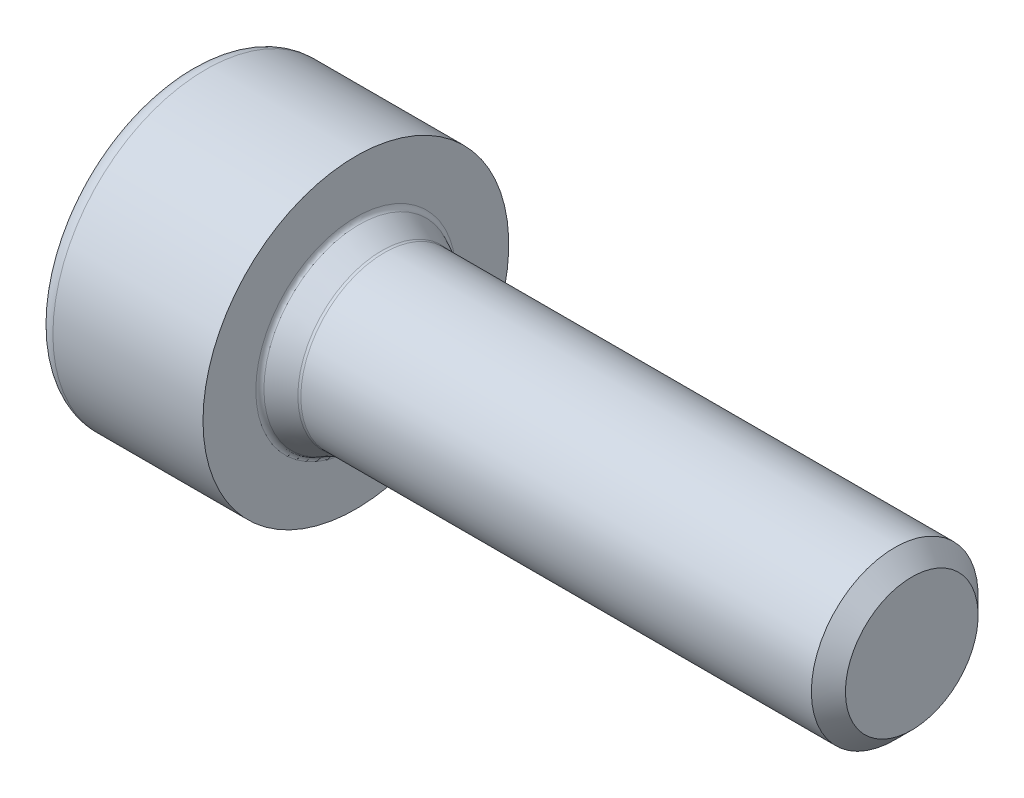
ISO-10303-21;
HEADER;
FILE_DESCRIPTION(('STEP AP214'),'2;1');
FILE_NAME('part.step','',(''),(''),'','','');
FILE_SCHEMA(('AUTOMOTIVE_DESIGN { 1 0 10303 214 1 1 1 1 }'));
ENDSEC;
DATA;
#1=APPLICATION_CONTEXT('core data for automotive mechanical design processes');
#2=APPLICATION_PROTOCOL_DEFINITION('international standard','automotive_design',2000,#1);
#3=PRODUCT_CONTEXT('',#1,'mechanical');
#4=PRODUCT('Part','Part','',(#3));
#5=PRODUCT_RELATED_PRODUCT_CATEGORY('part','',(#4));
#6=PRODUCT_DEFINITION_FORMATION('','',#4);
#7=PRODUCT_DEFINITION_CONTEXT('part definition',#1,'design');
#8=PRODUCT_DEFINITION('design','',#6,#7);
#9=PRODUCT_DEFINITION_SHAPE('','',#8);
#10=(LENGTH_UNIT() NAMED_UNIT(*) SI_UNIT(.MILLI.,.METRE.));
#11=(NAMED_UNIT(*) PLANE_ANGLE_UNIT() SI_UNIT($,.RADIAN.));
#12=(NAMED_UNIT(*) SI_UNIT($,.STERADIAN.) SOLID_ANGLE_UNIT());
#13=UNCERTAINTY_MEASURE_WITH_UNIT(LENGTH_MEASURE(1.E-05),#10,'distance_accuracy_value','');
#14=(GEOMETRIC_REPRESENTATION_CONTEXT(3) GLOBAL_UNCERTAINTY_ASSIGNED_CONTEXT((#13)) GLOBAL_UNIT_ASSIGNED_CONTEXT((#10,
#11,#12)) REPRESENTATION_CONTEXT('',''));
#15=CARTESIAN_POINT('',(0.,0.,0.));
#16=DIRECTION('',(0.,0.,1.));
#17=DIRECTION('',(1.,0.,0.));
#18=AXIS2_PLACEMENT_3D('',#15,#16,#17);
#19=CARTESIAN_POINT('',(-1.69999999999981,0.,0.));
#20=DIRECTION('',(-1.,0.,0.));
#21=DIRECTION('',(0.,0.,1.));
#22=AXIS2_PLACEMENT_3D('',#19,#20,#21);
#23=CONICAL_SURFACE('',#22,1.24999999999975,1.04719755119605);
#24=CARTESIAN_POINT('',(-0.97831216351274,0.,4.44089209850063E-13));
#25=VERTEX_POINT('',#24);
#26=VERTEX_LOOP('',#25);
#27=FACE_BOUND('',#26,.T.);
#28=CARTESIAN_POINT('',(-1.69999999999994,0.,0.));
#29=DIRECTION('',(-1.,0.,0.));
#30=DIRECTION('',(0.,0.,1.));
#31=AXIS2_PLACEMENT_3D('',#28,#29,#30);
#32=CIRCLE('',#31,1.24999999999997);
#33=CARTESIAN_POINT('',(-1.69999999999998,0.,1.24999999999998));
#34=VERTEX_POINT('',#33);
#35=CARTESIAN_POINT('',(-1.69999999999997,-1.08253175473054,0.624999999999992));
#36=VERTEX_POINT('',#35);
#37=EDGE_CURVE('E122',#34,#36,#32,.F.);
#38=ORIENTED_EDGE('',*,*,#37,.F.);
#39=CARTESIAN_POINT('',(-1.69999999999994,0.,0.));
#40=DIRECTION('',(-1.,0.,0.));
#41=DIRECTION('',(0.,0.,1.));
#42=AXIS2_PLACEMENT_3D('',#39,#40,#41);
#43=CIRCLE('',#42,1.24999999999997);
#44=CARTESIAN_POINT('',(-1.69999999999997,1.08253175473054,0.624999999999993));
#45=VERTEX_POINT('',#44);
#46=EDGE_CURVE('E645',#45,#34,#43,.F.);
#47=ORIENTED_EDGE('',*,*,#46,.F.);
#48=CARTESIAN_POINT('',(-1.69999999999994,0.,0.));
#49=DIRECTION('',(-1.,0.,0.));
#50=DIRECTION('',(0.,0.,1.));
#51=AXIS2_PLACEMENT_3D('',#48,#49,#50);
#52=CIRCLE('',#51,1.24999999999997);
#53=CARTESIAN_POINT('',(-1.69999999999997,1.08253175473054,-0.624999999999997));
#54=VERTEX_POINT('',#53);
#55=EDGE_CURVE('E111',#54,#45,#52,.F.);
#56=ORIENTED_EDGE('',*,*,#55,.F.);
#57=CARTESIAN_POINT('',(-1.69999999999994,0.,0.));
#58=DIRECTION('',(-1.,0.,0.));
#59=DIRECTION('',(0.,0.,1.));
#60=AXIS2_PLACEMENT_3D('',#57,#58,#59);
#61=CIRCLE('',#60,1.24999999999997);
#62=CARTESIAN_POINT('',(-1.69999999999998,0.,-1.24999999999999));
#63=VERTEX_POINT('',#62);
#64=EDGE_CURVE('E106',#63,#54,#61,.F.);
#65=ORIENTED_EDGE('',*,*,#64,.F.);
#66=CARTESIAN_POINT('',(-1.69999999999994,0.,0.));
#67=DIRECTION('',(-1.,0.,0.));
#68=DIRECTION('',(0.,0.,1.));
#69=AXIS2_PLACEMENT_3D('',#66,#67,#68);
#70=CIRCLE('',#69,1.24999999999997);
#71=CARTESIAN_POINT('',(-1.69999999999997,-1.08253175473054,-0.624999999999997));
#72=VERTEX_POINT('',#71);
#73=EDGE_CURVE('E104',#72,#63,#70,.F.);
#74=ORIENTED_EDGE('',*,*,#73,.F.);
#75=CARTESIAN_POINT('',(-1.69999999999994,0.,0.));
#76=DIRECTION('',(-1.,0.,0.));
#77=DIRECTION('',(0.,0.,1.));
#78=AXIS2_PLACEMENT_3D('',#75,#76,#77);
#79=CIRCLE('',#78,1.24999999999997);
#80=EDGE_CURVE('E101',#36,#72,#79,.F.);
#81=ORIENTED_EDGE('',*,*,#80,.F.);
#82=EDGE_LOOP('',(#38,#47,#56,#65,#74,#81));
#83=FACE_BOUND('',#82,.T.);
#84=ADVANCED_FACE('F16',(#27,#83),#23,.F.);
#85=CARTESIAN_POINT('',(-1.7,1.25,0.));
#86=DIRECTION('',(-1.,0.,0.));
#87=DIRECTION('',(0.,0.,1.));
#88=AXIS2_PLACEMENT_3D('',#85,#86,#87);
#89=PLANE('',#88);
#90=DIRECTION('',(0.,-0.5,0.866025403784439));
#91=VECTOR('',#90,1.);
#92=CARTESIAN_POINT('',(-1.7,-1.44337567297407,0.));
#93=LINE('',#92,#91);
#94=CARTESIAN_POINT('',(-1.7,-1.44337567297407,0.));
#95=VERTEX_POINT('',#94);
#96=EDGE_CURVE('E117',#95,#72,#93,.F.);
#97=ORIENTED_EDGE('',*,*,#96,.F.);
#98=DIRECTION('',(0.,0.5,0.866025403784439));
#99=VECTOR('',#98,1.);
#100=CARTESIAN_POINT('',(-1.7,-0.72168783648703,1.25));
#101=LINE('',#100,#99);
#102=EDGE_CURVE('E120',#36,#95,#101,.F.);
#103=ORIENTED_EDGE('',*,*,#102,.F.);
#104=ORIENTED_EDGE('',*,*,#80,.T.);
#105=EDGE_LOOP('',(#97,#103,#104));
#106=FACE_BOUND('',#105,.T.);
#107=ADVANCED_FACE('F115',(#106),#89,.T.);
#108=CARTESIAN_POINT('',(-1.7,1.25,0.));
#109=DIRECTION('',(-1.,0.,0.));
#110=DIRECTION('',(0.,0.,1.));
#111=AXIS2_PLACEMENT_3D('',#108,#109,#110);
#112=PLANE('',#111);
#113=DIRECTION('',(0.,0.5,0.866025403784439));
#114=VECTOR('',#113,1.);
#115=CARTESIAN_POINT('',(-1.7,-0.72168783648703,1.25));
#116=LINE('',#115,#114);
#117=CARTESIAN_POINT('',(-1.7,-0.72168783648703,1.25));
#118=VERTEX_POINT('',#117);
#119=EDGE_CURVE('E131',#118,#36,#116,.F.);
#120=ORIENTED_EDGE('',*,*,#119,.F.);
#121=DIRECTION('',(0.,1.,0.));
#122=VECTOR('',#121,1.);
#123=CARTESIAN_POINT('',(-1.7,0.72168783648703,1.25));
#124=LINE('',#123,#122);
#125=EDGE_CURVE('E612',#34,#118,#124,.F.);
#126=ORIENTED_EDGE('',*,*,#125,.F.);
#127=ORIENTED_EDGE('',*,*,#37,.T.);
#128=EDGE_LOOP('',(#120,#126,#127));
#129=FACE_BOUND('',#128,.T.);
#130=ADVANCED_FACE('F241',(#129),#112,.T.);
#131=CARTESIAN_POINT('',(-1.7,1.25,0.));
#132=DIRECTION('',(-1.,0.,0.));
#133=DIRECTION('',(0.,0.,1.));
#134=AXIS2_PLACEMENT_3D('',#131,#132,#133);
#135=PLANE('',#134);
#136=DIRECTION('',(0.,1.,0.));
#137=VECTOR('',#136,1.);
#138=CARTESIAN_POINT('',(-1.7,0.72168783648703,1.25));
#139=LINE('',#138,#137);
#140=CARTESIAN_POINT('',(-1.7,0.72168783648703,1.25));
#141=VERTEX_POINT('',#140);
#142=EDGE_CURVE('E616',#141,#34,#139,.F.);
#143=ORIENTED_EDGE('',*,*,#142,.F.);
#144=DIRECTION('',(0.,0.5,-0.866025403784439));
#145=VECTOR('',#144,1.);
#146=CARTESIAN_POINT('',(-1.7,1.44337567297407,0.));
#147=LINE('',#146,#145);
#148=EDGE_CURVE('E578',#45,#141,#147,.F.);
#149=ORIENTED_EDGE('',*,*,#148,.F.);
#150=ORIENTED_EDGE('',*,*,#46,.T.);
#151=EDGE_LOOP('',(#143,#149,#150));
#152=FACE_BOUND('',#151,.T.);
#153=ADVANCED_FACE('F237',(#152),#135,.T.);
#154=CARTESIAN_POINT('',(-1.7,1.25,0.));
#155=DIRECTION('',(-1.,0.,0.));
#156=DIRECTION('',(0.,0.,1.));
#157=AXIS2_PLACEMENT_3D('',#154,#155,#156);
#158=PLANE('',#157);
#159=DIRECTION('',(0.,0.5,-0.866025403784439));
#160=VECTOR('',#159,1.);
#161=CARTESIAN_POINT('',(-1.7,1.44337567297407,0.));
#162=LINE('',#161,#160);
#163=CARTESIAN_POINT('',(-1.7,1.44337567297407,0.));
#164=VERTEX_POINT('',#163);
#165=EDGE_CURVE('E611',#164,#45,#162,.F.);
#166=ORIENTED_EDGE('',*,*,#165,.F.);
#167=DIRECTION('',(0.,-0.5,-0.866025403784439));
#168=VECTOR('',#167,1.);
#169=CARTESIAN_POINT('',(-1.7,0.72168783648703,-1.25000000000003));
#170=LINE('',#169,#168);
#171=EDGE_CURVE('E605',#54,#164,#170,.F.);
#172=ORIENTED_EDGE('',*,*,#171,.F.);
#173=ORIENTED_EDGE('',*,*,#55,.T.);
#174=EDGE_LOOP('',(#166,#172,#173));
#175=FACE_BOUND('',#174,.T.);
#176=ADVANCED_FACE('F234',(#175),#158,.T.);
#177=CARTESIAN_POINT('',(-1.7,1.25,0.));
#178=DIRECTION('',(-1.,0.,0.));
#179=DIRECTION('',(0.,0.,1.));
#180=AXIS2_PLACEMENT_3D('',#177,#178,#179);
#181=PLANE('',#180);
#182=DIRECTION('',(0.,1.,0.));
#183=VECTOR('',#182,1.);
#184=CARTESIAN_POINT('',(-1.7,-0.72168783648703,-1.25000000000003));
#185=LINE('',#184,#183);
#186=CARTESIAN_POINT('',(-1.7,-0.72168783648703,-1.25000000000003));
#187=VERTEX_POINT('',#186);
#188=EDGE_CURVE('E127',#187,#63,#185,.T.);
#189=ORIENTED_EDGE('',*,*,#188,.F.);
#190=DIRECTION('',(0.,-0.5,0.866025403784439));
#191=VECTOR('',#190,1.);
#192=CARTESIAN_POINT('',(-1.7,-1.44337567297407,0.));
#193=LINE('',#192,#191);
#194=EDGE_CURVE('E124',#72,#187,#193,.F.);
#195=ORIENTED_EDGE('',*,*,#194,.F.);
#196=ORIENTED_EDGE('',*,*,#73,.T.);
#197=EDGE_LOOP('',(#189,#195,#196));
#198=FACE_BOUND('',#197,.T.);
#199=ADVANCED_FACE('F125',(#198),#181,.T.);
#200=CARTESIAN_POINT('',(-1.7,1.25,0.));
#201=DIRECTION('',(-1.,0.,0.));
#202=DIRECTION('',(0.,0.,1.));
#203=AXIS2_PLACEMENT_3D('',#200,#201,#202);
#204=PLANE('',#203);
#205=DIRECTION('',(0.,-0.5,-0.866025403784439));
#206=VECTOR('',#205,1.);
#207=CARTESIAN_POINT('',(-1.7,0.72168783648703,-1.25000000000003));
#208=LINE('',#207,#206);
#209=CARTESIAN_POINT('',(-1.7,0.72168783648703,-1.25000000000003));
#210=VERTEX_POINT('',#209);
#211=EDGE_CURVE('E579',#210,#54,#208,.F.);
#212=ORIENTED_EDGE('',*,*,#211,.F.);
#213=DIRECTION('',(0.,1.,0.));
#214=VECTOR('',#213,1.);
#215=CARTESIAN_POINT('',(-1.7,-0.72168783648703,-1.25000000000003));
#216=LINE('',#215,#214);
#217=EDGE_CURVE('E592',#63,#210,#216,.T.);
#218=ORIENTED_EDGE('',*,*,#217,.F.);
#219=ORIENTED_EDGE('',*,*,#64,.T.);
#220=EDGE_LOOP('',(#212,#218,#219));
#221=FACE_BOUND('',#220,.T.);
#222=ADVANCED_FACE('F228',(#221),#204,.T.);
#223=CARTESIAN_POINT('',(-1.7,-1.44337567297407,0.));
#224=DIRECTION('',(0.,0.866025403784439,0.5));
#225=DIRECTION('',(0.,-0.5,0.866025403784439));
#226=AXIS2_PLACEMENT_3D('',#223,#224,#225);
#227=PLANE('',#226);
#228=CARTESIAN_POINT('',(-2.99328866663875,-0.72168787979942,-1.24999992498077));
#229=CARTESIAN_POINT('',(-2.97497338439779,-0.75340168878277,-1.19506999652008));
#230=CARTESIAN_POINT('',(-2.95831659406379,-0.785389250915677,-1.13966591369562));
#231=CARTESIAN_POINT('',(-2.92924266753078,-0.8499182183631,-1.02789846351672));
#232=CARTESIAN_POINT('',(-2.91683581546103,-0.882460769858816,-0.971533110918213));
#233=CARTESIAN_POINT('',(-2.89752365672476,-0.947142589344778,-0.859500913242529));
#234=CARTESIAN_POINT('',(-2.89048980193531,-0.979271907998839,-0.803851300921124));
#235=CARTESIAN_POINT('',(-2.88209441922117,-1.04368164540765,-0.692290363226899));
#236=CARTESIAN_POINT('',(-2.88072593752403,-1.07596183021132,-0.636379443069219));
#237=CARTESIAN_POINT('',(-2.88358012603483,-1.13627388687365,-0.531915896621093));
#238=CARTESIAN_POINT('',(-2.88710199836376,-1.16431480907143,-0.483347594683448));
#239=CARTESIAN_POINT('',(-2.89826200692404,-1.22021397601539,-0.38652739743574));
#240=CARTESIAN_POINT('',(-2.90590395165721,-1.24807202756574,-0.338275836750661));
#241=CARTESIAN_POINT('',(-2.92500733343035,-1.3040863519613,-0.241256180945902));
#242=CARTESIAN_POINT('',(-2.93654971063368,-1.3322355390182,-0.19250035877159));
#243=CARTESIAN_POINT('',(-2.96274602680702,-1.38811418956114,-0.0957156969728343));
#244=CARTESIAN_POINT('',(-2.97739381464072,-1.41584436836444,-0.0476856183825602));
#245=CARTESIAN_POINT('',(-2.99328866663841,-1.44337562966112,-7.50202478699434E-08));
#246=B_SPLINE_CURVE_WITH_KNOTS('',3,(#228,#229,#230,#231,#232,#233,#234,#235,#236,#237,#238,
#239,#240,#241,#242,#243,#244,#245),.UNSPECIFIED.,.F.,.F.,(4,2,2,2,2,2,2,2,4),(0.,
0.198135001290404,0.3967461236142,0.590442236452416,0.783900532867314,0.952317303116865,
1.12089002161471,1.29320087403388,1.46517355319784),.UNSPECIFIED.);
#247=CARTESIAN_POINT('',(-2.99328869645124,-0.721687853135767,-1.25000000000003));
#248=VERTEX_POINT('',#247);
#249=CARTESIAN_POINT('',(-2.99328867914179,-1.4433756513176,-3.75101320084651E-08));
#250=VERTEX_POINT('',#249);
#251=EDGE_CURVE('E215',#248,#250,#246,.T.);
#252=ORIENTED_EDGE('',*,*,#251,.T.);
#253=DIRECTION('',(1.,0.,0.));
#254=VECTOR('',#253,1.);
#255=CARTESIAN_POINT('',(-1.7,-1.44337567297407,0.));
#256=LINE('',#255,#254);
#257=EDGE_CURVE('E135',#95,#250,#256,.F.);
#258=ORIENTED_EDGE('',*,*,#257,.F.);
#259=ORIENTED_EDGE('',*,*,#96,.T.);
#260=ORIENTED_EDGE('',*,*,#194,.T.);
#261=DIRECTION('',(1.,0.,0.));
#262=VECTOR('',#261,1.);
#263=CARTESIAN_POINT('',(-1.7,-0.72168783648703,-1.25000000000003));
#264=LINE('',#263,#262);
#265=EDGE_CURVE('E600',#248,#187,#264,.T.);
#266=ORIENTED_EDGE('',*,*,#265,.F.);
#267=EDGE_LOOP('',(#252,#258,#259,#260,#266));
#268=FACE_BOUND('',#267,.T.);
#269=ADVANCED_FACE('F133',(#268),#227,.T.);
#270=CARTESIAN_POINT('',(-1.7,-0.72168783648703,1.25));
#271=DIRECTION('',(0.,0.866025403784439,-0.5));
#272=DIRECTION('',(0.,0.5,0.866025403784439));
#273=AXIS2_PLACEMENT_3D('',#270,#271,#272);
#274=PLANE('',#273);
#275=CARTESIAN_POINT('',(-2.99328870125764,-1.44337568962337,-2.88374528146506E-08));
#276=CARTESIAN_POINT('',(-2.97497341618434,-1.41166187964764,0.0549299013421064));
#277=CARTESIAN_POINT('',(-2.95831662283933,-1.37967431651608,0.110333985896283));
#278=CARTESIAN_POINT('',(-2.92924269005167,-1.31514534697432,0.222101439702681));
#279=CARTESIAN_POINT('',(-2.91683583474184,-1.2826027943823,0.278466794200034));
#280=CARTESIAN_POINT('',(-2.89752366957887,-1.21792097270573,0.390498995669967));
#281=CARTESIAN_POINT('',(-2.89048981159007,-1.18579165296128,0.44614860987997));
#282=CARTESIAN_POINT('',(-2.88209442269988,-1.12138191324412,0.557709551572379));
#283=CARTESIAN_POINT('',(-2.88072593802374,-1.08910172722272,0.613620473839227));
#284=CARTESIAN_POINT('',(-2.8835801215882,-1.02878966546865,0.718084029106504));
#285=CARTESIAN_POINT('',(-2.88710199230702,-1.00074873941726,0.766652337718802));
#286=CARTESIAN_POINT('',(-2.89826199893625,-0.944849564753562,0.863472548337486));
#287=CARTESIAN_POINT('',(-2.90590394335132,-0.916991509337172,0.911724115718743));
#288=CARTESIAN_POINT('',(-2.92500732567709,-0.860977177072015,1.00874378515404));
#289=CARTESIAN_POINT('',(-2.93654970379273,-0.83282798601447,1.05749961425767));
#290=CARTESIAN_POINT('',(-2.96274602274178,-0.776949327593473,1.15428428970162));
#291=CARTESIAN_POINT('',(-2.97739381243506,-0.74921914491235,1.2023143750085));
#292=CARTESIAN_POINT('',(-2.99328866663901,-0.721687879798938,1.24999992498158));
#293=B_SPLINE_CURVE_WITH_KNOTS('',3,(#275,#276,#277,#278,#279,#280,#281,#282,#283,#284,#285,
#286,#287,#288,#289,#290,#291,#292),.UNSPECIFIED.,.F.,.F.,(4,2,2,2,2,2,2,2,4),(0.,
0.198135009379992,0.396746140002651,0.590442260390621,0.783900564276981,0.95231735722138,
1.12089009850169,1.29320097493828,1.46517367796622),.UNSPECIFIED.);
#294=CARTESIAN_POINT('',(-2.99328867914208,-0.721687858142984,1.24999996249079));
#295=VERTEX_POINT('',#294);
#296=EDGE_CURVE('E208',#250,#295,#293,.T.);
#297=ORIENTED_EDGE('',*,*,#296,.T.);
#298=DIRECTION('',(-1.,0.,0.));
#299=VECTOR('',#298,1.);
#300=CARTESIAN_POINT('',(-1.7,-0.72168783648703,1.25));
#301=LINE('',#300,#299);
#302=EDGE_CURVE('E571',#118,#295,#301,.T.);
#303=ORIENTED_EDGE('',*,*,#302,.F.);
#304=ORIENTED_EDGE('',*,*,#119,.T.);
#305=ORIENTED_EDGE('',*,*,#102,.T.);
#306=ORIENTED_EDGE('',*,*,#257,.T.);
#307=EDGE_LOOP('',(#297,#303,#304,#305,#306));
#308=FACE_BOUND('',#307,.T.);
#309=ADVANCED_FACE('F221',(#308),#274,.T.);
#310=CARTESIAN_POINT('',(-1.7,0.72168783648703,1.25));
#311=DIRECTION('',(0.,0.,-1.));
#312=DIRECTION('',(-1.,0.,0.));
#313=AXIS2_PLACEMENT_3D('',#310,#311,#312);
#314=PLANE('',#313);
#315=CARTESIAN_POINT('',(-2.99328870125703,-0.721687869783552,1.25));
#316=CARTESIAN_POINT('',(-2.97618480795014,-0.662444452003536,1.25));
#317=CARTESIAN_POINT('',(-2.96052571106334,-0.602732366174607,1.25));
#318=CARTESIAN_POINT('',(-2.93285020021977,-0.482338212966288,1.25));
#319=CARTESIAN_POINT('',(-2.92084193654443,-0.421654289105362,1.25));
#320=CARTESIAN_POINT('',(-2.90153119475369,-0.300967369275598,1.25));
#321=CARTESIAN_POINT('',(-2.89412575984543,-0.240981365063938,1.25));
#322=CARTESIAN_POINT('',(-2.88418440271366,-0.120663275771616,1.25));
#323=CARTESIAN_POINT('',(-2.88164319480625,-0.0603316378835071,1.25));
#324=CARTESIAN_POINT('',(-2.8816431948023,0.0603316277383398,1.25));
#325=CARTESIAN_POINT('',(-2.8841844018511,0.120663255472078,1.25));
#326=CARTESIAN_POINT('',(-2.89412575568746,0.240981324624899,1.25));
#327=CARTESIAN_POINT('',(-2.9015311881549,0.300967318851851,1.25));
#328=CARTESIAN_POINT('',(-2.92084192374652,0.421654218540089,1.25));
#329=CARTESIAN_POINT('',(-2.93285018361621,0.482338132254731,1.25));
#330=CARTESIAN_POINT('',(-2.96052568598876,0.602732265573223,1.25));
#331=CARTESIAN_POINT('',(-2.97618477821599,0.662444341657034,1.25));
#332=CARTESIAN_POINT('',(-2.99328866663281,0.721687749841729,1.25));
#333=B_SPLINE_CURVE_WITH_KNOTS('',3,(#315,#316,#317,#318,#319,#320,#321,#322,#323,#324,#325,
#326,#327,#328,#329,#330,#331,#332),.UNSPECIFIED.,.F.,.F.,(4,2,2,2,2,2,2,2,4),(0.,
0.185045881218883,0.370501883910891,0.551644313116085,0.732589792965019,0.913535242386292,
1.09467764104489,1.28013361170431,1.46517946115472),.UNSPECIFIED.);
#334=CARTESIAN_POINT('',(-2.99328867913898,0.72168779316438,1.25));
#335=VERTEX_POINT('',#334);
#336=EDGE_CURVE('E202',#295,#335,#333,.T.);
#337=ORIENTED_EDGE('',*,*,#336,.T.);
#338=DIRECTION('',(1.,0.,0.));
#339=VECTOR('',#338,1.);
#340=CARTESIAN_POINT('',(-1.7,0.72168783648703,1.25));
#341=LINE('',#340,#339);
#342=EDGE_CURVE('E567',#141,#335,#341,.F.);
#343=ORIENTED_EDGE('',*,*,#342,.F.);
#344=ORIENTED_EDGE('',*,*,#142,.T.);
#345=ORIENTED_EDGE('',*,*,#125,.T.);
#346=ORIENTED_EDGE('',*,*,#302,.T.);
#347=EDGE_LOOP('',(#337,#343,#344,#345,#346));
#348=FACE_BOUND('',#347,.T.);
#349=ADVANCED_FACE('F192',(#348),#314,.T.);
#350=CARTESIAN_POINT('',(-1.7,1.44337567297407,0.));
#351=DIRECTION('',(0.,-0.866025403784439,-0.5));
#352=DIRECTION('',(0.,0.5,-0.866025403784439));
#353=AXIS2_PLACEMENT_3D('',#350,#351,#352);
#354=PLANE('',#353);
#355=CARTESIAN_POINT('',(-2.99328870126323,0.721687819828027,1.25000002885424));
#356=CARTESIAN_POINT('',(-2.97497341618948,0.753401629803923,1.1950700986744));
#357=CARTESIAN_POINT('',(-2.95831662284399,0.785389192935642,1.13966601411995));
#358=CARTESIAN_POINT('',(-2.92924269005531,0.849918162477743,1.02789856031297));
#359=CARTESIAN_POINT('',(-2.91683583474496,0.882460715069935,0.971533205815306));
#360=CARTESIAN_POINT('',(-2.89752366958095,0.947142536746861,0.85950100434476));
#361=CARTESIAN_POINT('',(-2.89048981159163,0.979271856491482,0.803851390134451));
#362=CARTESIAN_POINT('',(-2.88209442270044,1.04368159620902,0.692290448441394));
#363=CARTESIAN_POINT('',(-2.88072593802382,1.07596178223062,0.636379526174204));
#364=CARTESIAN_POINT('',(-2.88358012158748,1.13627384398542,0.531915970905652));
#365=CARTESIAN_POINT('',(-2.88710199230602,1.16431477003735,0.483347662292427));
#366=CARTESIAN_POINT('',(-2.89826199893488,1.22021394470212,0.38652745167188));
#367=CARTESIAN_POINT('',(-2.90590394334985,1.24807200011905,0.33827588428969));
#368=CARTESIAN_POINT('',(-2.92500732567561,1.30408633238531,0.24125621485249));
#369=CARTESIAN_POINT('',(-2.93654970379133,1.33223552344341,0.19250038574789));
#370=CARTESIAN_POINT('',(-2.96274602274069,1.38811418186551,0.09571571030203));
#371=CARTESIAN_POINT('',(-2.97739381243419,1.41584436454717,0.0476856249942181));
#372=CARTESIAN_POINT('',(-2.99328866663841,1.44337562966112,7.50202148306189E-08));
#373=B_SPLINE_CURVE_WITH_KNOTS('',3,(#355,#356,#357,#358,#359,#360,#361,#362,#363,#364,#365,
#366,#367,#368,#369,#370,#371,#372),.UNSPECIFIED.,.F.,.F.,(4,2,2,2,2,2,2,2,4),(0.,
0.198135009381297,0.396746140005296,0.590442260394488,0.783900564282058,0.952317357229602,
1.12089009851307,1.29320097495299,1.46517367798424),.UNSPECIFIED.);
#374=CARTESIAN_POINT('',(-2.99328867914179,1.4433756513176,3.75100994181087E-08));
#375=VERTEX_POINT('',#374);
#376=EDGE_CURVE('E196',#335,#375,#373,.T.);
#377=ORIENTED_EDGE('',*,*,#376,.T.);
#378=DIRECTION('',(1.,0.,0.));
#379=VECTOR('',#378,1.);
#380=CARTESIAN_POINT('',(-1.7,1.44337567297407,0.));
#381=LINE('',#380,#379);
#382=EDGE_CURVE('E591',#164,#375,#381,.F.);
#383=ORIENTED_EDGE('',*,*,#382,.F.);
#384=ORIENTED_EDGE('',*,*,#165,.T.);
#385=ORIENTED_EDGE('',*,*,#148,.T.);
#386=ORIENTED_EDGE('',*,*,#342,.T.);
#387=EDGE_LOOP('',(#377,#383,#384,#385,#386));
#388=FACE_BOUND('',#387,.T.);
#389=ADVANCED_FACE('F187',(#388),#354,.T.);
#390=CARTESIAN_POINT('',(-1.7,0.72168783648703,-1.25000000000003));
#391=DIRECTION('',(0.,-0.866025403784439,0.5));
#392=DIRECTION('',(0.,-0.5,-0.866025403784439));
#393=AXIS2_PLACEMENT_3D('',#390,#391,#392);
#394=PLANE('',#393);
#395=CARTESIAN_POINT('',(-2.99328870125764,1.44337568962337,2.8837420172892E-08));
#396=CARTESIAN_POINT('',(-2.97497341618434,1.41166187964763,-0.0549299013421454));
#397=CARTESIAN_POINT('',(-2.95831662283933,1.37967431651607,-0.110333985896328));
#398=CARTESIAN_POINT('',(-2.92924269005166,1.3151453469743,-0.222101439702741));
#399=CARTESIAN_POINT('',(-2.91683583474184,1.28260279438228,-0.278466794200101));
#400=CARTESIAN_POINT('',(-2.89752366957888,1.21792097270571,-0.390498995670036));
#401=CARTESIAN_POINT('',(-2.89048981159008,1.18579165296127,-0.446148609880033));
#402=CARTESIAN_POINT('',(-2.88209442269989,1.12138191324411,-0.557709551572428));
#403=CARTESIAN_POINT('',(-2.88072593802375,1.08910172722271,-0.613620473839268));
#404=CARTESIAN_POINT('',(-2.88358012158826,1.0287896654677,-0.718084029108178));
#405=CARTESIAN_POINT('',(-2.88710199230727,1.00074873941536,-0.766652337722112));
#406=CARTESIAN_POINT('',(-2.89826199893716,0.944849564749795,-0.863472548344043));
#407=CARTESIAN_POINT('',(-2.90590394335269,0.916991509332476,-0.91172411572691));
#408=CARTESIAN_POINT('',(-2.9250073256796,0.860977177065439,-1.00874378516546));
#409=CARTESIAN_POINT('',(-2.93654970379594,0.832827986006944,-1.05749961427074));
#410=CARTESIAN_POINT('',(-2.96274602274653,0.776949327584083,-1.15428428971792));
#411=CARTESIAN_POINT('',(-2.97739381244066,0.749219144902044,-1.20231437502638));
#412=CARTESIAN_POINT('',(-2.9932886666455,0.721687879787729,-1.24999992500102));
#413=B_SPLINE_CURVE_WITH_KNOTS('',3,(#395,#396,#397,#398,#399,#400,#401,#402,#403,#404,#405,
#406,#407,#408,#409,#410,#411,#412),.UNSPECIFIED.,.F.,.F.,(4,2,2,2,2,2,2,2,4),(0.,
0.198135009380015,0.396746140002699,0.590442260390646,0.783900564276981,0.952317357227059,
1.12089009851307,1.29320097495566,1.46517367798954),.UNSPECIFIED.);
#414=CARTESIAN_POINT('',(-2.99328867914537,0.721687858137311,-1.24999996250065));
#415=VERTEX_POINT('',#414);
#416=EDGE_CURVE('E169',#375,#415,#413,.T.);
#417=ORIENTED_EDGE('',*,*,#416,.T.);
#418=DIRECTION('',(1.,0.,0.));
#419=VECTOR('',#418,1.);
#420=CARTESIAN_POINT('',(-1.7,0.72168783648703,-1.25000000000003));
#421=LINE('',#420,#419);
#422=EDGE_CURVE('E588',#210,#415,#421,.F.);
#423=ORIENTED_EDGE('',*,*,#422,.F.);
#424=ORIENTED_EDGE('',*,*,#211,.T.);
#425=ORIENTED_EDGE('',*,*,#171,.T.);
#426=ORIENTED_EDGE('',*,*,#382,.T.);
#427=EDGE_LOOP('',(#417,#423,#424,#425,#426));
#428=FACE_BOUND('',#427,.T.);
#429=ADVANCED_FACE('F182',(#428),#394,.T.);
#430=CARTESIAN_POINT('',(-1.7,-0.72168783648703,-1.25000000000003));
#431=DIRECTION('',(0.,0.,1.));
#432=DIRECTION('',(1.,0.,0.));
#433=AXIS2_PLACEMENT_3D('',#430,#431,#432);
#434=PLANE('',#433);
#435=CARTESIAN_POINT('',(-2.99328870126308,0.721687869804448,-1.25000000000003));
#436=CARTESIAN_POINT('',(-2.9761848079455,0.662444451988044,-1.25000000000003));
#437=CARTESIAN_POINT('',(-2.96052571104951,0.602732366122353,-1.25000000000003));
#438=CARTESIAN_POINT('',(-2.93285020019104,0.482338212833254,-1.25000000000003));
#439=CARTESIAN_POINT('',(-2.92084193651037,0.42165428892822,-1.25000000000003));
#440=CARTESIAN_POINT('',(-2.9015311947292,0.300967369087433,-1.25000000000003));
#441=CARTESIAN_POINT('',(-2.89412575983011,0.240981364909807,-1.25000000000003));
#442=CARTESIAN_POINT('',(-2.88418440270978,0.120663275693132,-1.25000000000003));
#443=CARTESIAN_POINT('',(-2.8816431948043,0.0603316378466642,-1.25000000000003));
#444=CARTESIAN_POINT('',(-2.88164319480429,-0.0603316378446148,-1.25000000000003));
#445=CARTESIAN_POINT('',(-2.88418440270962,-0.120663275689426,-1.25000000000003));
#446=CARTESIAN_POINT('',(-2.89412575982939,-0.240981364902817,-1.25000000000003));
#447=CARTESIAN_POINT('',(-2.90153119472807,-0.300967369078817,-1.25000000000003));
#448=CARTESIAN_POINT('',(-2.92084193650821,-0.421654288916321,-1.25000000000003));
#449=CARTESIAN_POINT('',(-2.93285020018825,-0.482338212819701,-1.25000000000003));
#450=CARTESIAN_POINT('',(-2.96052571104532,-0.602732366105559,-1.25000000000003));
#451=CARTESIAN_POINT('',(-2.97618480794055,-0.662444451969662,-1.25000000000003));
#452=CARTESIAN_POINT('',(-2.99328870125732,-0.721687869784503,-1.25000000000003));
#453=B_SPLINE_CURVE_WITH_KNOTS('',3,(#435,#436,#437,#438,#439,#440,#441,#442,#443,#444,#445,
#446,#447,#448,#449,#450,#451,#452),.UNSPECIFIED.,.F.,.F.,(4,2,2,2,2,2,2,2,4),(0.,
0.185045881332433,0.370501884157273,0.551644313256696,0.732589792986529,0.913535272711397,
1.09467770180584,1.28013370462545,1.4651795859527),.UNSPECIFIED.);
#454=EDGE_CURVE('E161',#415,#248,#453,.T.);
#455=ORIENTED_EDGE('',*,*,#454,.T.);
#456=ORIENTED_EDGE('',*,*,#265,.T.);
#457=ORIENTED_EDGE('',*,*,#188,.T.);
#458=ORIENTED_EDGE('',*,*,#217,.T.);
#459=ORIENTED_EDGE('',*,*,#422,.T.);
#460=EDGE_LOOP('',(#455,#456,#457,#458,#459));
#461=FACE_BOUND('',#460,.T.);
#462=ADVANCED_FACE('F179',(#461),#434,.T.);
#463=CARTESIAN_POINT('',(-2.99999999992906,0.,0.));
#464=DIRECTION('',(-1.,0.,0.));
#465=DIRECTION('',(0.,0.,1.));
#466=AXIS2_PLACEMENT_3D('',#463,#464,#465);
#467=CONICAL_SURFACE('',#466,1.45499999990761,1.04719755121765);
#468=ORIENTED_EDGE('',*,*,#336,.F.);
#469=ORIENTED_EDGE('',*,*,#296,.F.);
#470=ORIENTED_EDGE('',*,*,#251,.F.);
#471=ORIENTED_EDGE('',*,*,#454,.F.);
#472=ORIENTED_EDGE('',*,*,#416,.F.);
#473=ORIENTED_EDGE('',*,*,#376,.F.);
#474=EDGE_LOOP('',(#468,#469,#470,#471,#472,#473));
#475=FACE_BOUND('',#474,.T.);
#476=CARTESIAN_POINT('',(-2.99999999996188,0.,0.));
#477=DIRECTION('',(-1.,0.,0.));
#478=DIRECTION('',(0.,0.,1.));
#479=AXIS2_PLACEMENT_3D('',#476,#477,#478);
#480=CIRCLE('',#479,1.45499999996446);
#481=CARTESIAN_POINT('',(-2.99999999996188,0.,1.45499999996446));
#482=VERTEX_POINT('',#481);
#483=EDGE_CURVE('E157',#482,#482,#480,.T.);
#484=ORIENTED_EDGE('',*,*,#483,.T.);
#485=EDGE_LOOP('',(#484));
#486=FACE_BOUND('',#485,.T.);
#487=ADVANCED_FACE('F176',(#475,#486),#467,.F.);
#488=CARTESIAN_POINT('',(-3.,0.,0.));
#489=DIRECTION('',(1.,0.,0.));
#490=DIRECTION('',(0.,0.,-1.));
#491=AXIS2_PLACEMENT_3D('',#488,#489,#490);
#492=PLANE('',#491);
#493=CARTESIAN_POINT('',(-3.,0.,0.));
#494=DIRECTION('',(1.,0.,0.));
#495=DIRECTION('',(0.,0.,1.));
#496=AXIS2_PLACEMENT_3D('',#493,#494,#495);
#497=CIRCLE('',#496,2.45);
#498=CARTESIAN_POINT('',(-3.,0.,2.45000000000001));
#499=VERTEX_POINT('',#498);
#500=CARTESIAN_POINT('',(-3.,0.,-2.45000000000001));
#501=VERTEX_POINT('',#500);
#502=EDGE_CURVE('E160',#499,#501,#497,.T.);
#503=ORIENTED_EDGE('',*,*,#502,.F.);
#504=CARTESIAN_POINT('',(-3.,0.,0.));
#505=DIRECTION('',(1.,0.,0.));
#506=DIRECTION('',(0.,0.,-1.));
#507=AXIS2_PLACEMENT_3D('',#504,#505,#506);
#508=CIRCLE('',#507,2.45);
#509=EDGE_CURVE('E305',#501,#499,#508,.T.);
#510=ORIENTED_EDGE('',*,*,#509,.F.);
#511=EDGE_LOOP('',(#503,#510));
#512=FACE_BOUND('',#511,.T.);
#513=ORIENTED_EDGE('',*,*,#483,.F.);
#514=EDGE_LOOP('',(#513));
#515=FACE_BOUND('',#514,.T.);
#516=ADVANCED_FACE('F310',(#512,#515),#492,.F.);
#517=CARTESIAN_POINT('',(-2.70000000000012,0.,0.));
#518=DIRECTION('',(-1.,0.,0.));
#519=DIRECTION('',(0.,0.,1.));
#520=AXIS2_PLACEMENT_3D('',#517,#518,#519);
#521=TOROIDAL_SURFACE('',#520,2.45000000000012,0.299999999999878);
#522=ORIENTED_EDGE('',*,*,#502,.T.);
#523=ORIENTED_EDGE('',*,*,#509,.T.);
#524=EDGE_LOOP('',(#522,#523));
#525=FACE_BOUND('',#524,.T.);
#526=CARTESIAN_POINT('',(-2.7,0.,0.));
#527=DIRECTION('',(-1.,0.,0.));
#528=DIRECTION('',(0.,0.,1.));
#529=AXIS2_PLACEMENT_3D('',#526,#527,#528);
#530=CIRCLE('',#529,2.75);
#531=CARTESIAN_POINT('',(-2.7,0.,2.75));
#532=VERTEX_POINT('',#531);
#533=EDGE_CURVE('E156',#532,#532,#530,.F.);
#534=ORIENTED_EDGE('',*,*,#533,.F.);
#535=EDGE_LOOP('',(#534));
#536=FACE_BOUND('',#535,.T.);
#537=ADVANCED_FACE('F303',(#525,#536),#521,.T.);
#538=CARTESIAN_POINT('',(10.,0.,0.));
#539=DIRECTION('',(-1.,0.,0.));
#540=DIRECTION('',(0.,0.,1.));
#541=AXIS2_PLACEMENT_3D('',#538,#539,#540);
#542=CYLINDRICAL_SURFACE('',#541,2.75);
#543=ORIENTED_EDGE('',*,*,#533,.T.);
#544=EDGE_LOOP('',(#543));
#545=FACE_BOUND('',#544,.T.);
#546=CARTESIAN_POINT('',(0.,0.,0.));
#547=DIRECTION('',(-1.,0.,0.));
#548=DIRECTION('',(0.,0.,1.));
#549=AXIS2_PLACEMENT_3D('',#546,#547,#548);
#550=CIRCLE('',#549,2.75);
#551=CARTESIAN_POINT('',(0.,0.,2.75));
#552=VERTEX_POINT('',#551);
#553=EDGE_CURVE('E152',#552,#552,#550,.T.);
#554=ORIENTED_EDGE('',*,*,#553,.T.);
#555=EDGE_LOOP('',(#554));
#556=FACE_BOUND('',#555,.T.);
#557=ADVANCED_FACE('F330',(#545,#556),#542,.T.);
#558=CARTESIAN_POINT('',(0.,0.,-2.75));
#559=DIRECTION('',(-1.,0.,0.));
#560=DIRECTION('',(0.,0.,1.));
#561=AXIS2_PLACEMENT_3D('',#558,#559,#560);
#562=PLANE('',#561);
#563=ORIENTED_EDGE('',*,*,#553,.F.);
#564=EDGE_LOOP('',(#563));
#565=FACE_BOUND('',#564,.T.);
#566=CARTESIAN_POINT('',(0.,0.,0.));
#567=DIRECTION('',(1.,0.,0.));
#568=DIRECTION('',(0.,0.,1.));
#569=AXIS2_PLACEMENT_3D('',#566,#567,#568);
#570=CIRCLE('',#569,1.79999999999998);
#571=CARTESIAN_POINT('',(0.,0.,-1.79999999999998));
#572=VERTEX_POINT('',#571);
#573=CARTESIAN_POINT('',(0.,0.,1.79999999999998));
#574=VERTEX_POINT('',#573);
#575=EDGE_CURVE('E155',#572,#574,#570,.F.);
#576=ORIENTED_EDGE('',*,*,#575,.T.);
#577=CARTESIAN_POINT('',(0.,0.,0.));
#578=DIRECTION('',(1.,0.,0.));
#579=DIRECTION('',(0.,0.,-1.));
#580=AXIS2_PLACEMENT_3D('',#577,#578,#579);
#581=CIRCLE('',#580,1.79999999999997);
#582=EDGE_CURVE('E35',#574,#572,#581,.F.);
#583=ORIENTED_EDGE('',*,*,#582,.T.);
#584=EDGE_LOOP('',(#576,#583));
#585=FACE_BOUND('',#584,.T.);
#586=ADVANCED_FACE('F281',(#565,#585),#562,.F.);
#587=CARTESIAN_POINT('',(0.0999999999999548,0.,0.));
#588=DIRECTION('',(-1.,0.,0.));
#589=DIRECTION('',(0.,0.,1.));
#590=AXIS2_PLACEMENT_3D('',#587,#588,#589);
#591=TOROIDAL_SURFACE('',#590,1.79999999999996,0.0999999999999548);
#592=ORIENTED_EDGE('',*,*,#582,.F.);
#593=ORIENTED_EDGE('',*,*,#575,.F.);
#594=EDGE_LOOP('',(#592,#593));
#595=FACE_BOUND('',#594,.T.);
#596=CARTESIAN_POINT('',(0.0561576368340866,0.,0.));
#597=DIRECTION('',(-1.,0.,0.));
#598=DIRECTION('',(0.,0.,1.));
#599=AXIS2_PLACEMENT_3D('',#596,#597,#598);
#600=CIRCLE('',#599,1.7101231554193);
#601=CARTESIAN_POINT('',(0.0561576368340866,0.,1.7101231554193));
#602=VERTEX_POINT('',#601);
#603=EDGE_CURVE('E151',#602,#602,#600,.F.);
#604=ORIENTED_EDGE('',*,*,#603,.F.);
#605=EDGE_LOOP('',(#604));
#606=FACE_BOUND('',#605,.T.);
#607=ADVANCED_FACE('F275',(#595,#606),#591,.F.);
#608=CARTESIAN_POINT('',(10.,0.,-1.1935));
#609=DIRECTION('',(-1.,0.,0.));
#610=DIRECTION('',(0.,0.,1.));
#611=AXIS2_PLACEMENT_3D('',#608,#609,#610);
#612=PLANE('',#611);
#613=CARTESIAN_POINT('',(9.99999999999091,0.,0.));
#614=DIRECTION('',(-1.,0.,0.));
#615=DIRECTION('',(0.,0.,1.));
#616=AXIS2_PLACEMENT_3D('',#613,#614,#615);
#617=CIRCLE('',#616,1.19350000005625);
#618=CARTESIAN_POINT('',(9.99999999999091,0.,1.19350000005625));
#619=VERTEX_POINT('',#618);
#620=EDGE_CURVE('E147',#619,#619,#617,.T.);
#621=ORIENTED_EDGE('',*,*,#620,.F.);
#622=EDGE_LOOP('',(#621));
#623=FACE_BOUND('',#622,.T.);
#624=ADVANCED_FACE('F280',(#623),#612,.F.);
#625=CARTESIAN_POINT('',(0.0561576367203998,0.,0.));
#626=DIRECTION('',(-1.,0.,0.));
#627=DIRECTION('',(0.,0.,1.));
#628=AXIS2_PLACEMENT_3D('',#625,#626,#627);
#629=CONICAL_SURFACE('',#628,1.71012315547614,0.453844001491463);
#630=ORIENTED_EDGE('',*,*,#603,.T.);
#631=EDGE_LOOP('',(#630));
#632=FACE_BOUND('',#631,.T.);
#633=CARTESIAN_POINT('',(0.46615763679786,0.,0.));
#634=DIRECTION('',(-1.,0.,0.));
#635=DIRECTION('',(0.,0.,1.));
#636=AXIS2_PLACEMENT_3D('',#633,#634,#635);
#637=CIRCLE('',#636,1.5101231554356);
#638=CARTESIAN_POINT('',(0.46615763679786,0.,1.5101231554356));
#639=VERTEX_POINT('',#638);
#640=EDGE_CURVE('E150',#639,#639,#637,.T.);
#641=ORIENTED_EDGE('',*,*,#640,.T.);
#642=EDGE_LOOP('',(#641));
#643=FACE_BOUND('',#642,.T.);
#644=ADVANCED_FACE('F522',(#632,#643),#629,.T.);
#645=CARTESIAN_POINT('',(9.69350000002578,0.,0.));
#646=DIRECTION('',(-1.,0.,0.));
#647=DIRECTION('',(0.,0.,1.));
#648=AXIS2_PLACEMENT_3D('',#645,#646,#647);
#649=CONICAL_SURFACE('',#648,1.49999999996453,0.785398163304718);
#650=CARTESIAN_POINT('',(9.6935,0.,0.));
#651=DIRECTION('',(-1.,0.,0.));
#652=DIRECTION('',(0.,0.,1.));
#653=AXIS2_PLACEMENT_3D('',#650,#651,#652);
#654=CIRCLE('',#653,1.5);
#655=CARTESIAN_POINT('',(9.6935,0.,1.5));
#656=VERTEX_POINT('',#655);
#657=EDGE_CURVE('E27',#656,#656,#654,.T.);
#658=ORIENTED_EDGE('',*,*,#657,.F.);
#659=EDGE_LOOP('',(#658));
#660=FACE_BOUND('',#659,.T.);
#661=ORIENTED_EDGE('',*,*,#620,.T.);
#662=EDGE_LOOP('',(#661));
#663=FACE_BOUND('',#662,.T.);
#664=ADVANCED_FACE('F259',(#660,#663),#649,.T.);
#665=CARTESIAN_POINT('',(0.50999999999974,0.,0.));
#666=DIRECTION('',(-1.,0.,0.));
#667=DIRECTION('',(0.,0.,1.));
#668=AXIS2_PLACEMENT_3D('',#665,#666,#667);
#669=TOROIDAL_SURFACE('',#668,1.59999999999896,0.0999999999989575);
#670=ORIENTED_EDGE('',*,*,#640,.F.);
#671=EDGE_LOOP('',(#670));
#672=FACE_BOUND('',#671,.T.);
#673=CARTESIAN_POINT('',(0.51,0.,0.));
#674=DIRECTION('',(-1.,0.,0.));
#675=DIRECTION('',(0.,0.,1.));
#676=AXIS2_PLACEMENT_3D('',#673,#674,#675);
#677=CIRCLE('',#676,1.5);
#678=CARTESIAN_POINT('',(0.51,0.,1.5));
#679=VERTEX_POINT('',#678);
#680=EDGE_CURVE('E11',#679,#679,#677,.F.);
#681=ORIENTED_EDGE('',*,*,#680,.F.);
#682=EDGE_LOOP('',(#681));
#683=FACE_BOUND('',#682,.T.);
#684=ADVANCED_FACE('F253',(#672,#683),#669,.F.);
#685=CARTESIAN_POINT('',(10.,0.,0.));
#686=DIRECTION('',(-1.,0.,0.));
#687=DIRECTION('',(0.,0.,1.));
#688=AXIS2_PLACEMENT_3D('',#685,#686,#687);
#689=CYLINDRICAL_SURFACE('',#688,1.5);
#690=ORIENTED_EDGE('',*,*,#680,.T.);
#691=EDGE_LOOP('',(#690));
#692=FACE_BOUND('',#691,.T.);
#693=ORIENTED_EDGE('',*,*,#657,.T.);
#694=EDGE_LOOP('',(#693));
#695=FACE_BOUND('',#694,.T.);
#696=ADVANCED_FACE('F251',(#692,#695),#689,.T.);
#697=CLOSED_SHELL('',(#84,#107,#130,#153,#176,#199,#222,#269,#309,#349,#389,#429,#462,#487,#516,
#537,#557,#586,#607,#624,#644,#664,#684,#696));
#698=MANIFOLD_SOLID_BREP('B1',#697);
#699=ADVANCED_BREP_SHAPE_REPRESENTATION('',(#18,#698),#14);
#700=SHAPE_DEFINITION_REPRESENTATION(#9,#699);
ENDSEC;
END-ISO-10303-21;
